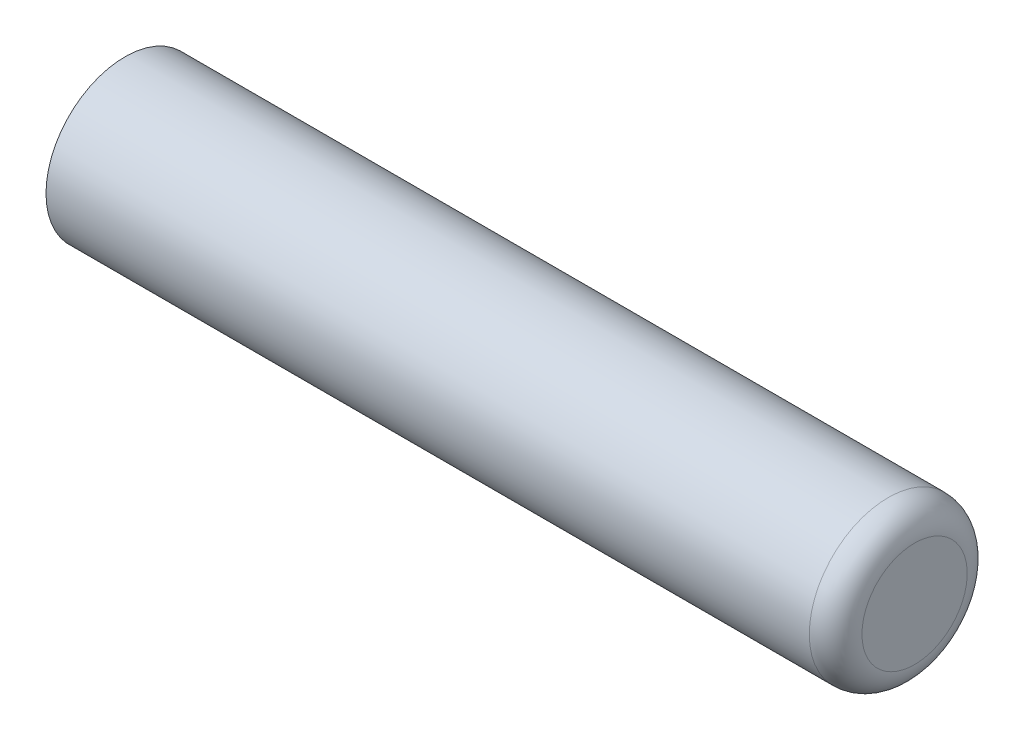
ISO-10303-21;
HEADER;
FILE_DESCRIPTION(('STEP AP214'),'2;1');
FILE_NAME('part.step','',(''),(''),'','','');
FILE_SCHEMA(('AUTOMOTIVE_DESIGN { 1 0 10303 214 1 1 1 1 }'));
ENDSEC;
DATA;
#1=APPLICATION_CONTEXT('core data for automotive mechanical design processes');
#2=APPLICATION_PROTOCOL_DEFINITION('international standard','automotive_design',2000,#1);
#3=PRODUCT_CONTEXT('',#1,'mechanical');
#4=PRODUCT('Part','Part','',(#3));
#5=PRODUCT_RELATED_PRODUCT_CATEGORY('part','',(#4));
#6=PRODUCT_DEFINITION_FORMATION('','',#4);
#7=PRODUCT_DEFINITION_CONTEXT('part definition',#1,'design');
#8=PRODUCT_DEFINITION('design','',#6,#7);
#9=PRODUCT_DEFINITION_SHAPE('','',#8);
#10=(LENGTH_UNIT() NAMED_UNIT(*) SI_UNIT(.MILLI.,.METRE.));
#11=(NAMED_UNIT(*) PLANE_ANGLE_UNIT() SI_UNIT($,.RADIAN.));
#12=(NAMED_UNIT(*) SI_UNIT($,.STERADIAN.) SOLID_ANGLE_UNIT());
#13=UNCERTAINTY_MEASURE_WITH_UNIT(LENGTH_MEASURE(1.E-05),#10,'distance_accuracy_value','');
#14=(GEOMETRIC_REPRESENTATION_CONTEXT(3) GLOBAL_UNCERTAINTY_ASSIGNED_CONTEXT((#13)) GLOBAL_UNIT_ASSIGNED_CONTEXT((#10,
#11,#12)) REPRESENTATION_CONTEXT('',''));
#15=CARTESIAN_POINT('',(0.,0.,0.));
#16=DIRECTION('',(0.,0.,1.));
#17=DIRECTION('',(1.,0.,0.));
#18=AXIS2_PLACEMENT_3D('',#15,#16,#17);
#19=CARTESIAN_POINT('',(7.5,0.,-1.));
#20=DIRECTION('',(-1.,0.,0.));
#21=DIRECTION('',(0.,0.,1.));
#22=AXIS2_PLACEMENT_3D('',#19,#20,#21);
#23=PLANE('',#22);
#24=CARTESIAN_POINT('',(7.5,0.,0.));
#25=DIRECTION('',(-1.,0.,0.));
#26=DIRECTION('',(0.,0.,1.));
#27=AXIS2_PLACEMENT_3D('',#24,#25,#26);
#28=CIRCLE('',#27,1.);
#29=CARTESIAN_POINT('',(7.5,0.,1.));
#30=VERTEX_POINT('',#29);
#31=EDGE_CURVE('E41',#30,#30,#28,.T.);
#32=ORIENTED_EDGE('',*,*,#31,.F.);
#33=EDGE_LOOP('',(#32));
#34=FACE_BOUND('',#33,.T.);
#35=ADVANCED_FACE('F31',(#34),#23,.F.);
#36=CARTESIAN_POINT('',(-7.5,0.,-1.5));
#37=DIRECTION('',(1.,0.,0.));
#38=DIRECTION('',(0.,0.,-1.));
#39=AXIS2_PLACEMENT_3D('',#36,#37,#38);
#40=PLANE('',#39);
#41=CARTESIAN_POINT('',(-7.5,0.,0.));
#42=DIRECTION('',(-1.,0.,0.));
#43=DIRECTION('',(0.,0.,1.));
#44=AXIS2_PLACEMENT_3D('',#41,#42,#43);
#45=CIRCLE('',#44,1.5);
#46=CARTESIAN_POINT('',(-7.5,0.,1.5));
#47=VERTEX_POINT('',#46);
#48=EDGE_CURVE('E10',#47,#47,#45,.T.);
#49=ORIENTED_EDGE('',*,*,#48,.T.);
#50=EDGE_LOOP('',(#49));
#51=FACE_BOUND('',#50,.T.);
#52=ADVANCED_FACE('F51',(#51),#40,.F.);
#53=CARTESIAN_POINT('',(-7.5,0.,0.));
#54=DIRECTION('',(-1.,0.,0.));
#55=DIRECTION('',(0.,0.,1.));
#56=AXIS2_PLACEMENT_3D('',#53,#54,#55);
#57=CYLINDRICAL_SURFACE('',#56,1.5);
#58=ORIENTED_EDGE('',*,*,#48,.F.);
#59=EDGE_LOOP('',(#58));
#60=FACE_BOUND('',#59,.T.);
#61=CARTESIAN_POINT('',(7.,0.,0.));
#62=DIRECTION('',(-1.,0.,0.));
#63=DIRECTION('',(0.,0.,1.));
#64=AXIS2_PLACEMENT_3D('',#61,#62,#63);
#65=CIRCLE('',#64,1.5);
#66=CARTESIAN_POINT('',(7.,0.,1.5));
#67=VERTEX_POINT('',#66);
#68=EDGE_CURVE('E37',#67,#67,#65,.T.);
#69=ORIENTED_EDGE('',*,*,#68,.T.);
#70=EDGE_LOOP('',(#69));
#71=FACE_BOUND('',#70,.T.);
#72=ADVANCED_FACE('F55',(#60,#71),#57,.T.);
#73=CARTESIAN_POINT('',(7.,0.,0.));
#74=DIRECTION('',(-1.,0.,0.));
#75=DIRECTION('',(0.,0.,1.));
#76=AXIS2_PLACEMENT_3D('',#73,#74,#75);
#77=TOROIDAL_SURFACE('',#76,1.,0.5);
#78=ORIENTED_EDGE('',*,*,#68,.F.);
#79=EDGE_LOOP('',(#78));
#80=FACE_BOUND('',#79,.T.);
#81=ORIENTED_EDGE('',*,*,#31,.T.);
#82=EDGE_LOOP('',(#81));
#83=FACE_BOUND('',#82,.T.);
#84=ADVANCED_FACE('F48',(#80,#83),#77,.T.);
#85=CLOSED_SHELL('',(#35,#52,#72,#84));
#86=MANIFOLD_SOLID_BREP('B2',#85);
#87=ADVANCED_BREP_SHAPE_REPRESENTATION('',(#18,#86),#14);
#88=SHAPE_DEFINITION_REPRESENTATION(#9,#87);
ENDSEC;
END-ISO-10303-21;
